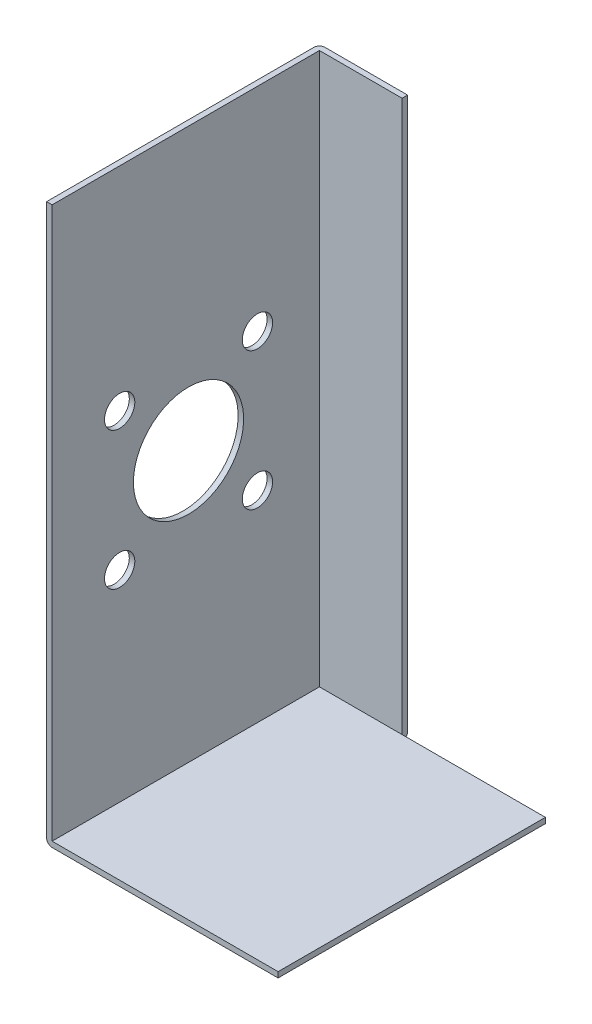
ISO-10303-21;
HEADER;
FILE_DESCRIPTION(('STEP AP214'),'2;1');
FILE_NAME('part.step','',(''),(''),'','','');
FILE_SCHEMA(('AUTOMOTIVE_DESIGN { 1 0 10303 214 1 1 1 1 }'));
ENDSEC;
DATA;
#1=APPLICATION_CONTEXT('core data for automotive mechanical design processes');
#2=APPLICATION_PROTOCOL_DEFINITION('international standard','automotive_design',2000,#1);
#3=PRODUCT_CONTEXT('',#1,'mechanical');
#4=PRODUCT('Part','Part','',(#3));
#5=PRODUCT_RELATED_PRODUCT_CATEGORY('part','',(#4));
#6=PRODUCT_DEFINITION_FORMATION('','',#4);
#7=PRODUCT_DEFINITION_CONTEXT('part definition',#1,'design');
#8=PRODUCT_DEFINITION('design','',#6,#7);
#9=PRODUCT_DEFINITION_SHAPE('','',#8);
#10=(LENGTH_UNIT() NAMED_UNIT(*) SI_UNIT(.MILLI.,.METRE.));
#11=(NAMED_UNIT(*) PLANE_ANGLE_UNIT() SI_UNIT($,.RADIAN.));
#12=(NAMED_UNIT(*) SI_UNIT($,.STERADIAN.) SOLID_ANGLE_UNIT());
#13=UNCERTAINTY_MEASURE_WITH_UNIT(LENGTH_MEASURE(1.E-05),#10,'distance_accuracy_value','');
#14=(GEOMETRIC_REPRESENTATION_CONTEXT(3) GLOBAL_UNCERTAINTY_ASSIGNED_CONTEXT((#13)) GLOBAL_UNIT_ASSIGNED_CONTEXT((#10,
#11,#12)) REPRESENTATION_CONTEXT('',''));
#15=CARTESIAN_POINT('',(0.,0.,0.));
#16=DIRECTION('',(0.,0.,1.));
#17=DIRECTION('',(1.,0.,0.));
#18=AXIS2_PLACEMENT_3D('',#15,#16,#17);
#19=CARTESIAN_POINT('',(2.,0.,0.));
#20=DIRECTION('',(-1.,0.,0.));
#21=DIRECTION('',(0.,0.,1.));
#22=AXIS2_PLACEMENT_3D('',#19,#20,#21);
#23=PLANE('',#22);
#24=CARTESIAN_POINT('',(2.,75.,-74.5));
#25=DIRECTION('',(-1.,0.,0.));
#26=DIRECTION('',(0.,0.,1.));
#27=AXIS2_PLACEMENT_3D('',#24,#25,#26);
#28=CIRCLE('',#27,5.49999999999999);
#29=CARTESIAN_POINT('',(2.,75.,-69.));
#30=VERTEX_POINT('',#29);
#31=EDGE_CURVE('E235',#30,#30,#28,.T.);
#32=ORIENTED_EDGE('',*,*,#31,.T.);
#33=EDGE_LOOP('',(#32));
#34=FACE_BOUND('',#33,.T.);
#35=CARTESIAN_POINT('',(2.,75.,-24.5));
#36=DIRECTION('',(-1.,0.,0.));
#37=DIRECTION('',(0.,0.,1.));
#38=AXIS2_PLACEMENT_3D('',#35,#36,#37);
#39=CIRCLE('',#38,5.5);
#40=CARTESIAN_POINT('',(2.,75.,-19.));
#41=VERTEX_POINT('',#40);
#42=EDGE_CURVE('E361',#41,#41,#39,.T.);
#43=ORIENTED_EDGE('',*,*,#42,.T.);
#44=EDGE_LOOP('',(#43));
#45=FACE_BOUND('',#44,.T.);
#46=CARTESIAN_POINT('',(2.,125.,-74.5));
#47=DIRECTION('',(-1.,0.,0.));
#48=DIRECTION('',(0.,0.,1.));
#49=AXIS2_PLACEMENT_3D('',#46,#47,#48);
#50=CIRCLE('',#49,5.49999999999999);
#51=CARTESIAN_POINT('',(2.,125.,-69.));
#52=VERTEX_POINT('',#51);
#53=EDGE_CURVE('E355',#52,#52,#50,.T.);
#54=ORIENTED_EDGE('',*,*,#53,.T.);
#55=EDGE_LOOP('',(#54));
#56=FACE_BOUND('',#55,.T.);
#57=CARTESIAN_POINT('',(2.,125.,-24.5));
#58=DIRECTION('',(-1.,0.,0.));
#59=DIRECTION('',(0.,0.,1.));
#60=AXIS2_PLACEMENT_3D('',#57,#58,#59);
#61=CIRCLE('',#60,5.5);
#62=CARTESIAN_POINT('',(2.,125.,-19.));
#63=VERTEX_POINT('',#62);
#64=EDGE_CURVE('E352',#63,#63,#61,.T.);
#65=ORIENTED_EDGE('',*,*,#64,.T.);
#66=EDGE_LOOP('',(#65));
#67=FACE_BOUND('',#66,.T.);
#68=CARTESIAN_POINT('',(2.,100.,-49.5));
#69=DIRECTION('',(-1.,0.,0.));
#70=DIRECTION('',(0.,0.,1.));
#71=AXIS2_PLACEMENT_3D('',#68,#69,#70);
#72=CIRCLE('',#71,20.);
#73=CARTESIAN_POINT('',(2.,100.,-29.5));
#74=VERTEX_POINT('',#73);
#75=EDGE_CURVE('E356',#74,#74,#72,.T.);
#76=ORIENTED_EDGE('',*,*,#75,.T.);
#77=EDGE_LOOP('',(#76));
#78=FACE_BOUND('',#77,.T.);
#79=DIRECTION('',(0.,-1.,0.));
#80=VECTOR('',#79,1.);
#81=CARTESIAN_POINT('',(2.,202.,-97.));
#82=LINE('',#81,#80);
#83=CARTESIAN_POINT('',(2.,202.,-97.));
#84=VERTEX_POINT('',#83);
#85=CARTESIAN_POINT('',(2.,2.,-97.));
#86=VERTEX_POINT('',#85);
#87=EDGE_CURVE('E136',#84,#86,#82,.T.);
#88=ORIENTED_EDGE('',*,*,#87,.F.);
#89=DIRECTION('',(0.,0.,1.));
#90=VECTOR('',#89,1.);
#91=CARTESIAN_POINT('',(2.,202.,0.));
#92=LINE('',#91,#90);
#93=CARTESIAN_POINT('',(2.,202.,0.));
#94=VERTEX_POINT('',#93);
#95=EDGE_CURVE('E197',#84,#94,#92,.T.);
#96=ORIENTED_EDGE('',*,*,#95,.T.);
#97=DIRECTION('',(0.,-1.,0.));
#98=VECTOR('',#97,1.);
#99=CARTESIAN_POINT('',(2.,0.,0.));
#100=LINE('',#99,#98);
#101=CARTESIAN_POINT('',(2.,2.,0.));
#102=VERTEX_POINT('',#101);
#103=EDGE_CURVE('E194',#94,#102,#100,.T.);
#104=ORIENTED_EDGE('',*,*,#103,.T.);
#105=DIRECTION('',(0.,0.,1.));
#106=VECTOR('',#105,1.);
#107=CARTESIAN_POINT('',(2.,2.,0.));
#108=LINE('',#107,#106);
#109=EDGE_CURVE('E163',#86,#102,#108,.T.);
#110=ORIENTED_EDGE('',*,*,#109,.F.);
#111=EDGE_LOOP('',(#88,#96,#104,#110));
#112=FACE_BOUND('',#111,.T.);
#113=ADVANCED_FACE('F41',(#34,#45,#56,#67,#78,#112),#23,.F.);
#114=CARTESIAN_POINT('',(84.,2.,-97.));
#115=DIRECTION('',(0.,0.,1.));
#116=DIRECTION('',(1.,0.,0.));
#117=AXIS2_PLACEMENT_3D('',#114,#115,#116);
#118=PLANE('',#117);
#119=DIRECTION('',(0.,-1.,0.));
#120=VECTOR('',#119,1.);
#121=CARTESIAN_POINT('',(32.,202.,-97.));
#122=LINE('',#121,#120);
#123=CARTESIAN_POINT('',(32.,2.,-97.));
#124=VERTEX_POINT('',#123);
#125=CARTESIAN_POINT('',(32.,0.,-97.));
#126=VERTEX_POINT('',#125);
#127=EDGE_CURVE('E151',#124,#126,#122,.T.);
#128=ORIENTED_EDGE('',*,*,#127,.F.);
#129=DIRECTION('',(-1.,0.,0.));
#130=VECTOR('',#129,1.);
#131=CARTESIAN_POINT('',(84.,2.,-97.));
#132=LINE('',#131,#130);
#133=CARTESIAN_POINT('',(84.,2.,-97.));
#134=VERTEX_POINT('',#133);
#135=EDGE_CURVE('E185',#134,#124,#132,.T.);
#136=ORIENTED_EDGE('',*,*,#135,.F.);
#137=DIRECTION('',(0.,1.,0.));
#138=VECTOR('',#137,1.);
#139=CARTESIAN_POINT('',(84.,2.,-97.));
#140=LINE('',#139,#138);
#141=CARTESIAN_POINT('',(84.,0.,-97.));
#142=VERTEX_POINT('',#141);
#143=EDGE_CURVE('E171',#142,#134,#140,.T.);
#144=ORIENTED_EDGE('',*,*,#143,.F.);
#145=DIRECTION('',(-1.,0.,0.));
#146=VECTOR('',#145,1.);
#147=CARTESIAN_POINT('',(84.,0.,-97.));
#148=LINE('',#147,#146);
#149=EDGE_CURVE('E189',#142,#126,#148,.T.);
#150=ORIENTED_EDGE('',*,*,#149,.T.);
#151=EDGE_LOOP('',(#128,#136,#144,#150));
#152=FACE_BOUND('',#151,.T.);
#153=ADVANCED_FACE('F258',(#152),#118,.F.);
#154=CARTESIAN_POINT('',(2.,0.,0.));
#155=DIRECTION('',(0.,0.,-1.));
#156=DIRECTION('',(-1.,0.,0.));
#157=AXIS2_PLACEMENT_3D('',#154,#155,#156);
#158=PLANE('',#157);
#159=DIRECTION('',(0.,-1.,0.));
#160=VECTOR('',#159,1.);
#161=CARTESIAN_POINT('',(0.,0.,0.));
#162=LINE('',#161,#160);
#163=CARTESIAN_POINT('',(0.,202.,0.));
#164=VERTEX_POINT('',#163);
#165=CARTESIAN_POINT('',(0.,2.,0.));
#166=VERTEX_POINT('',#165);
#167=EDGE_CURVE('E193',#164,#166,#162,.T.);
#168=ORIENTED_EDGE('',*,*,#167,.T.);
#169=CARTESIAN_POINT('',(2.,2.,0.));
#170=DIRECTION('',(0.,0.,-1.));
#171=DIRECTION('',(-1.,0.,0.));
#172=AXIS2_PLACEMENT_3D('',#169,#170,#171);
#173=CIRCLE('',#172,2.);
#174=CARTESIAN_POINT('',(2.,0.,0.));
#175=VERTEX_POINT('',#174);
#176=EDGE_CURVE('E51',#166,#175,#173,.F.);
#177=ORIENTED_EDGE('',*,*,#176,.T.);
#178=DIRECTION('',(-1.,0.,0.));
#179=VECTOR('',#178,1.);
#180=CARTESIAN_POINT('',(2.,0.,0.));
#181=LINE('',#180,#179);
#182=CARTESIAN_POINT('',(84.,0.,0.));
#183=VERTEX_POINT('',#182);
#184=EDGE_CURVE('E143',#183,#175,#181,.T.);
#185=ORIENTED_EDGE('',*,*,#184,.F.);
#186=DIRECTION('',(0.,-1.,0.));
#187=VECTOR('',#186,1.);
#188=CARTESIAN_POINT('',(84.,0.,0.));
#189=LINE('',#188,#187);
#190=CARTESIAN_POINT('',(84.,2.,0.));
#191=VERTEX_POINT('',#190);
#192=EDGE_CURVE('E164',#191,#183,#189,.T.);
#193=ORIENTED_EDGE('',*,*,#192,.F.);
#194=DIRECTION('',(-1.,0.,0.));
#195=VECTOR('',#194,1.);
#196=CARTESIAN_POINT('',(84.,2.,0.));
#197=LINE('',#196,#195);
#198=EDGE_CURVE('E177',#191,#102,#197,.T.);
#199=ORIENTED_EDGE('',*,*,#198,.T.);
#200=ORIENTED_EDGE('',*,*,#103,.F.);
#201=DIRECTION('',(-1.,0.,0.));
#202=VECTOR('',#201,1.);
#203=CARTESIAN_POINT('',(2.,202.,0.));
#204=LINE('',#203,#202);
#205=EDGE_CURVE('E144',#94,#164,#204,.T.);
#206=ORIENTED_EDGE('',*,*,#205,.T.);
#207=EDGE_LOOP('',(#168,#177,#185,#193,#199,#200,#206));
#208=FACE_BOUND('',#207,.T.);
#209=ADVANCED_FACE('F270',(#208),#158,.F.);
#210=CARTESIAN_POINT('',(2.,0.,0.));
#211=DIRECTION('',(0.,1.,0.));
#212=DIRECTION('',(0.,0.,1.));
#213=AXIS2_PLACEMENT_3D('',#210,#211,#212);
#214=PLANE('',#213);
#215=DIRECTION('',(0.,0.,-1.));
#216=VECTOR('',#215,1.);
#217=CARTESIAN_POINT('',(2.,0.,-99.));
#218=LINE('',#217,#216);
#219=CARTESIAN_POINT('',(2.,0.,-97.));
#220=VERTEX_POINT('',#219);
#221=EDGE_CURVE('E217',#175,#220,#218,.T.);
#222=ORIENTED_EDGE('',*,*,#221,.T.);
#223=DIRECTION('',(-1.,0.,0.));
#224=VECTOR('',#223,1.);
#225=CARTESIAN_POINT('',(2.,0.,-97.));
#226=LINE('',#225,#224);
#227=EDGE_CURVE('E220',#220,#126,#226,.F.);
#228=ORIENTED_EDGE('',*,*,#227,.T.);
#229=ORIENTED_EDGE('',*,*,#149,.F.);
#230=DIRECTION('',(0.,0.,-1.));
#231=VECTOR('',#230,1.);
#232=CARTESIAN_POINT('',(84.,0.,0.));
#233=LINE('',#232,#231);
#234=EDGE_CURVE('E168',#183,#142,#233,.T.);
#235=ORIENTED_EDGE('',*,*,#234,.F.);
#236=ORIENTED_EDGE('',*,*,#184,.T.);
#237=EDGE_LOOP('',(#222,#228,#229,#235,#236));
#238=FACE_BOUND('',#237,.T.);
#239=ADVANCED_FACE('F251',(#238),#214,.F.);
#240=CARTESIAN_POINT('',(2.,0.,-99.));
#241=DIRECTION('',(0.,0.,1.));
#242=DIRECTION('',(1.,0.,0.));
#243=AXIS2_PLACEMENT_3D('',#240,#241,#242);
#244=PLANE('',#243);
#245=DIRECTION('',(0.,1.,0.));
#246=VECTOR('',#245,1.);
#247=CARTESIAN_POINT('',(32.,202.,-99.));
#248=LINE('',#247,#246);
#249=CARTESIAN_POINT('',(32.,2.,-99.));
#250=VERTEX_POINT('',#249);
#251=CARTESIAN_POINT('',(32.,202.,-99.));
#252=VERTEX_POINT('',#251);
#253=EDGE_CURVE('E122',#250,#252,#248,.T.);
#254=ORIENTED_EDGE('',*,*,#253,.F.);
#255=DIRECTION('',(-1.,0.,0.));
#256=VECTOR('',#255,1.);
#257=CARTESIAN_POINT('',(2.,2.,-99.));
#258=LINE('',#257,#256);
#259=CARTESIAN_POINT('',(2.,2.,-99.));
#260=VERTEX_POINT('',#259);
#261=EDGE_CURVE('E214',#250,#260,#258,.T.);
#262=ORIENTED_EDGE('',*,*,#261,.T.);
#263=DIRECTION('',(0.,1.,0.));
#264=VECTOR('',#263,1.);
#265=CARTESIAN_POINT('',(2.,202.,-99.));
#266=LINE('',#265,#264);
#267=CARTESIAN_POINT('',(2.,202.,-99.));
#268=VERTEX_POINT('',#267);
#269=EDGE_CURVE('E141',#260,#268,#266,.T.);
#270=ORIENTED_EDGE('',*,*,#269,.T.);
#271=DIRECTION('',(-1.,0.,0.));
#272=VECTOR('',#271,1.);
#273=CARTESIAN_POINT('',(2.,202.,-99.));
#274=LINE('',#273,#272);
#275=EDGE_CURVE('E138',#252,#268,#274,.T.);
#276=ORIENTED_EDGE('',*,*,#275,.F.);
#277=EDGE_LOOP('',(#254,#262,#270,#276));
#278=FACE_BOUND('',#277,.T.);
#279=ADVANCED_FACE('F139',(#278),#244,.F.);
#280=CARTESIAN_POINT('',(2.,202.,0.));
#281=DIRECTION('',(0.,-1.,0.));
#282=DIRECTION('',(0.,0.,-1.));
#283=AXIS2_PLACEMENT_3D('',#280,#281,#282);
#284=PLANE('',#283);
#285=ORIENTED_EDGE('',*,*,#275,.T.);
#286=CARTESIAN_POINT('',(2.,202.,-97.));
#287=DIRECTION('',(0.,-1.,0.));
#288=DIRECTION('',(0.,0.,-1.));
#289=AXIS2_PLACEMENT_3D('',#286,#287,#288);
#290=CIRCLE('',#289,2.);
#291=CARTESIAN_POINT('',(0.,202.,-97.));
#292=VERTEX_POINT('',#291);
#293=EDGE_CURVE('E11',#268,#292,#290,.F.);
#294=ORIENTED_EDGE('',*,*,#293,.T.);
#295=DIRECTION('',(0.,0.,1.));
#296=VECTOR('',#295,1.);
#297=CARTESIAN_POINT('',(0.,202.,0.));
#298=LINE('',#297,#296);
#299=EDGE_CURVE('E198',#292,#164,#298,.T.);
#300=ORIENTED_EDGE('',*,*,#299,.T.);
#301=ORIENTED_EDGE('',*,*,#205,.F.);
#302=ORIENTED_EDGE('',*,*,#95,.F.);
#303=DIRECTION('',(-1.,0.,0.));
#304=VECTOR('',#303,1.);
#305=CARTESIAN_POINT('',(32.,202.,-97.));
#306=LINE('',#305,#304);
#307=CARTESIAN_POINT('',(32.,202.,-97.));
#308=VERTEX_POINT('',#307);
#309=EDGE_CURVE('E148',#308,#84,#306,.T.);
#310=ORIENTED_EDGE('',*,*,#309,.F.);
#311=DIRECTION('',(0.,0.,1.));
#312=VECTOR('',#311,1.);
#313=CARTESIAN_POINT('',(32.,202.,-99.));
#314=LINE('',#313,#312);
#315=EDGE_CURVE('E128',#252,#308,#314,.T.);
#316=ORIENTED_EDGE('',*,*,#315,.F.);
#317=EDGE_LOOP('',(#285,#294,#300,#301,#302,#310,#316));
#318=FACE_BOUND('',#317,.T.);
#319=ADVANCED_FACE('F146',(#318),#284,.F.);
#320=CARTESIAN_POINT('',(0.,0.,0.));
#321=DIRECTION('',(-1.,0.,0.));
#322=DIRECTION('',(0.,0.,1.));
#323=AXIS2_PLACEMENT_3D('',#320,#321,#322);
#324=PLANE('',#323);
#325=CARTESIAN_POINT('',(0.,75.,-74.5));
#326=DIRECTION('',(-1.,0.,0.));
#327=DIRECTION('',(0.,0.,1.));
#328=AXIS2_PLACEMENT_3D('',#325,#326,#327);
#329=CIRCLE('',#328,5.49999999999999);
#330=CARTESIAN_POINT('',(0.,75.,-69.));
#331=VERTEX_POINT('',#330);
#332=EDGE_CURVE('E384',#331,#331,#329,.T.);
#333=ORIENTED_EDGE('',*,*,#332,.F.);
#334=EDGE_LOOP('',(#333));
#335=FACE_BOUND('',#334,.T.);
#336=CARTESIAN_POINT('',(0.,75.,-24.5));
#337=DIRECTION('',(-1.,0.,0.));
#338=DIRECTION('',(0.,0.,-1.));
#339=AXIS2_PLACEMENT_3D('',#336,#337,#338);
#340=CIRCLE('',#339,5.5);
#341=CARTESIAN_POINT('',(0.,75.,-30.));
#342=VERTEX_POINT('',#341);
#343=EDGE_CURVE('E388',#342,#342,#340,.T.);
#344=ORIENTED_EDGE('',*,*,#343,.F.);
#345=EDGE_LOOP('',(#344));
#346=FACE_BOUND('',#345,.T.);
#347=CARTESIAN_POINT('',(0.,125.,-74.5));
#348=DIRECTION('',(-1.,0.,0.));
#349=DIRECTION('',(0.,0.,-1.));
#350=AXIS2_PLACEMENT_3D('',#347,#348,#349);
#351=CIRCLE('',#350,5.49999999999999);
#352=CARTESIAN_POINT('',(0.,125.,-80.));
#353=VERTEX_POINT('',#352);
#354=EDGE_CURVE('E392',#353,#353,#351,.T.);
#355=ORIENTED_EDGE('',*,*,#354,.F.);
#356=EDGE_LOOP('',(#355));
#357=FACE_BOUND('',#356,.T.);
#358=CARTESIAN_POINT('',(0.,125.,-24.5));
#359=DIRECTION('',(-1.,0.,0.));
#360=DIRECTION('',(0.,0.,1.));
#361=AXIS2_PLACEMENT_3D('',#358,#359,#360);
#362=CIRCLE('',#361,5.5);
#363=CARTESIAN_POINT('',(0.,125.,-19.));
#364=VERTEX_POINT('',#363);
#365=EDGE_CURVE('E349',#364,#364,#362,.T.);
#366=ORIENTED_EDGE('',*,*,#365,.F.);
#367=EDGE_LOOP('',(#366));
#368=FACE_BOUND('',#367,.T.);
#369=CARTESIAN_POINT('',(0.,100.,-49.5));
#370=DIRECTION('',(-1.,0.,0.));
#371=DIRECTION('',(0.,0.,1.));
#372=AXIS2_PLACEMENT_3D('',#369,#370,#371);
#373=CIRCLE('',#372,20.);
#374=CARTESIAN_POINT('',(0.,100.,-29.5));
#375=VERTEX_POINT('',#374);
#376=EDGE_CURVE('E364',#375,#375,#373,.T.);
#377=ORIENTED_EDGE('',*,*,#376,.F.);
#378=EDGE_LOOP('',(#377));
#379=FACE_BOUND('',#378,.T.);
#380=DIRECTION('',(0.,1.,0.));
#381=VECTOR('',#380,1.);
#382=CARTESIAN_POINT('',(0.,0.,-97.));
#383=LINE('',#382,#381);
#384=CARTESIAN_POINT('',(0.,2.,-97.));
#385=VERTEX_POINT('',#384);
#386=EDGE_CURVE('E59',#292,#385,#383,.F.);
#387=ORIENTED_EDGE('',*,*,#386,.T.);
#388=DIRECTION('',(0.,0.,-1.));
#389=VECTOR('',#388,1.);
#390=CARTESIAN_POINT('',(0.,2.,0.));
#391=LINE('',#390,#389);
#392=EDGE_CURVE('E227',#385,#166,#391,.F.);
#393=ORIENTED_EDGE('',*,*,#392,.T.);
#394=ORIENTED_EDGE('',*,*,#167,.F.);
#395=ORIENTED_EDGE('',*,*,#299,.F.);
#396=EDGE_LOOP('',(#387,#393,#394,#395));
#397=FACE_BOUND('',#396,.T.);
#398=ADVANCED_FACE('F269',(#335,#346,#357,#368,#379,#397),#324,.T.);
#399=CARTESIAN_POINT('',(84.,2.,0.));
#400=DIRECTION('',(0.,-1.,0.));
#401=DIRECTION('',(0.,0.,-1.));
#402=AXIS2_PLACEMENT_3D('',#399,#400,#401);
#403=PLANE('',#402);
#404=ORIENTED_EDGE('',*,*,#109,.T.);
#405=ORIENTED_EDGE('',*,*,#198,.F.);
#406=DIRECTION('',(0.,0.,1.));
#407=VECTOR('',#406,1.);
#408=CARTESIAN_POINT('',(84.,2.,0.));
#409=LINE('',#408,#407);
#410=EDGE_CURVE('E174',#134,#191,#409,.T.);
#411=ORIENTED_EDGE('',*,*,#410,.F.);
#412=ORIENTED_EDGE('',*,*,#135,.T.);
#413=EDGE_CURVE('E184',#124,#86,#132,.T.);
#414=ORIENTED_EDGE('',*,*,#413,.T.);
#415=EDGE_LOOP('',(#404,#405,#411,#412,#414));
#416=FACE_BOUND('',#415,.T.);
#417=ADVANCED_FACE('F280',(#416),#403,.F.);
#418=CARTESIAN_POINT('',(84.,0.,0.));
#419=DIRECTION('',(-1.,0.,0.));
#420=DIRECTION('',(0.,0.,1.));
#421=AXIS2_PLACEMENT_3D('',#418,#419,#420);
#422=PLANE('',#421);
#423=ORIENTED_EDGE('',*,*,#192,.T.);
#424=ORIENTED_EDGE('',*,*,#234,.T.);
#425=ORIENTED_EDGE('',*,*,#143,.T.);
#426=ORIENTED_EDGE('',*,*,#410,.T.);
#427=EDGE_LOOP('',(#423,#424,#425,#426));
#428=FACE_BOUND('',#427,.T.);
#429=ADVANCED_FACE('F261',(#428),#422,.F.);
#430=CARTESIAN_POINT('',(32.,202.,-97.));
#431=DIRECTION('',(0.,0.,-1.));
#432=DIRECTION('',(0.,1.,0.));
#433=AXIS2_PLACEMENT_3D('',#430,#431,#432);
#434=PLANE('',#433);
#435=ORIENTED_EDGE('',*,*,#87,.T.);
#436=ORIENTED_EDGE('',*,*,#413,.F.);
#437=EDGE_CURVE('E154',#308,#124,#122,.T.);
#438=ORIENTED_EDGE('',*,*,#437,.F.);
#439=ORIENTED_EDGE('',*,*,#309,.T.);
#440=EDGE_LOOP('',(#435,#436,#438,#439));
#441=FACE_BOUND('',#440,.T.);
#442=ADVANCED_FACE('F278',(#441),#434,.F.);
#443=CARTESIAN_POINT('',(32.,0.,0.));
#444=DIRECTION('',(-1.,0.,0.));
#445=DIRECTION('',(0.,0.,1.));
#446=AXIS2_PLACEMENT_3D('',#443,#444,#445);
#447=PLANE('',#446);
#448=ORIENTED_EDGE('',*,*,#127,.T.);
#449=CARTESIAN_POINT('',(32.,2.,-97.));
#450=DIRECTION('',(-1.,0.,0.));
#451=DIRECTION('',(0.,0.,1.));
#452=AXIS2_PLACEMENT_3D('',#449,#450,#451);
#453=CIRCLE('',#452,2.);
#454=EDGE_CURVE('E131',#126,#250,#453,.F.);
#455=ORIENTED_EDGE('',*,*,#454,.T.);
#456=ORIENTED_EDGE('',*,*,#253,.T.);
#457=ORIENTED_EDGE('',*,*,#315,.T.);
#458=ORIENTED_EDGE('',*,*,#437,.T.);
#459=EDGE_LOOP('',(#448,#455,#456,#457,#458));
#460=FACE_BOUND('',#459,.T.);
#461=ADVANCED_FACE('F125',(#460),#447,.F.);
#462=CARTESIAN_POINT('',(2.,0.,-97.));
#463=DIRECTION('',(0.,-1.,0.));
#464=DIRECTION('',(0.,0.,-1.));
#465=AXIS2_PLACEMENT_3D('',#462,#463,#464);
#466=CYLINDRICAL_SURFACE('',#465,2.);
#467=ORIENTED_EDGE('',*,*,#293,.F.);
#468=ORIENTED_EDGE('',*,*,#269,.F.);
#469=CARTESIAN_POINT('',(2.,2.,-97.));
#470=DIRECTION('',(0.,-1.,0.));
#471=DIRECTION('',(0.,0.,-1.));
#472=AXIS2_PLACEMENT_3D('',#469,#470,#471);
#473=CIRCLE('',#472,2.);
#474=EDGE_CURVE('E45',#385,#260,#473,.T.);
#475=ORIENTED_EDGE('',*,*,#474,.F.);
#476=ORIENTED_EDGE('',*,*,#386,.F.);
#477=EDGE_LOOP('',(#467,#468,#475,#476));
#478=FACE_BOUND('',#477,.T.);
#479=ADVANCED_FACE('F43',(#478),#466,.T.);
#480=CARTESIAN_POINT('',(2.,2.,0.));
#481=DIRECTION('',(0.,0.,1.));
#482=DIRECTION('',(1.,0.,0.));
#483=AXIS2_PLACEMENT_3D('',#480,#481,#482);
#484=CYLINDRICAL_SURFACE('',#483,2.);
#485=ORIENTED_EDGE('',*,*,#176,.F.);
#486=ORIENTED_EDGE('',*,*,#392,.F.);
#487=CARTESIAN_POINT('',(2.,2.,-97.));
#488=DIRECTION('',(0.,0.,-1.));
#489=DIRECTION('',(-1.,0.,0.));
#490=AXIS2_PLACEMENT_3D('',#487,#488,#489);
#491=CIRCLE('',#490,2.);
#492=EDGE_CURVE('E234',#220,#385,#491,.T.);
#493=ORIENTED_EDGE('',*,*,#492,.F.);
#494=ORIENTED_EDGE('',*,*,#221,.F.);
#495=EDGE_LOOP('',(#485,#486,#493,#494));
#496=FACE_BOUND('',#495,.T.);
#497=ADVANCED_FACE('F267',(#496),#484,.T.);
#498=CARTESIAN_POINT('',(2.,2.,-97.));
#499=DIRECTION('',(-1.,0.,0.));
#500=DIRECTION('',(0.,0.,1.));
#501=AXIS2_PLACEMENT_3D('',#498,#499,#500);
#502=SPHERICAL_SURFACE('',#501,2.);
#503=ORIENTED_EDGE('',*,*,#492,.T.);
#504=ORIENTED_EDGE('',*,*,#474,.T.);
#505=CARTESIAN_POINT('',(2.,2.,-97.));
#506=DIRECTION('',(-1.,0.,0.));
#507=DIRECTION('',(0.,0.,1.));
#508=AXIS2_PLACEMENT_3D('',#505,#506,#507);
#509=CIRCLE('',#508,2.);
#510=EDGE_CURVE('E232',#220,#260,#509,.F.);
#511=ORIENTED_EDGE('',*,*,#510,.F.);
#512=EDGE_LOOP('',(#503,#504,#511));
#513=FACE_BOUND('',#512,.T.);
#514=ADVANCED_FACE('F244',(#513),#502,.T.);
#515=CARTESIAN_POINT('',(2.,2.,-97.));
#516=DIRECTION('',(-1.,0.,0.));
#517=DIRECTION('',(0.,0.,1.));
#518=AXIS2_PLACEMENT_3D('',#515,#516,#517);
#519=CYLINDRICAL_SURFACE('',#518,2.);
#520=ORIENTED_EDGE('',*,*,#454,.F.);
#521=ORIENTED_EDGE('',*,*,#227,.F.);
#522=ORIENTED_EDGE('',*,*,#510,.T.);
#523=ORIENTED_EDGE('',*,*,#261,.F.);
#524=EDGE_LOOP('',(#520,#521,#522,#523));
#525=FACE_BOUND('',#524,.T.);
#526=ADVANCED_FACE('F247',(#525),#519,.T.);
#527=CARTESIAN_POINT('',(41.,100.,-49.5));
#528=DIRECTION('',(-1.,0.,0.));
#529=DIRECTION('',(0.,0.,1.));
#530=AXIS2_PLACEMENT_3D('',#527,#528,#529);
#531=CYLINDRICAL_SURFACE('',#530,20.);
#532=ORIENTED_EDGE('',*,*,#376,.T.);
#533=EDGE_LOOP('',(#532));
#534=FACE_BOUND('',#533,.T.);
#535=ORIENTED_EDGE('',*,*,#75,.F.);
#536=EDGE_LOOP('',(#535));
#537=FACE_BOUND('',#536,.T.);
#538=ADVANCED_FACE('F311',(#534,#537),#531,.F.);
#539=CARTESIAN_POINT('',(41.,125.,-24.5));
#540=DIRECTION('',(-1.,0.,0.));
#541=DIRECTION('',(0.,0.,1.));
#542=AXIS2_PLACEMENT_3D('',#539,#540,#541);
#543=CYLINDRICAL_SURFACE('',#542,5.5);
#544=ORIENTED_EDGE('',*,*,#365,.T.);
#545=EDGE_LOOP('',(#544));
#546=FACE_BOUND('',#545,.T.);
#547=ORIENTED_EDGE('',*,*,#64,.F.);
#548=EDGE_LOOP('',(#547));
#549=FACE_BOUND('',#548,.T.);
#550=ADVANCED_FACE('F328',(#546,#549),#543,.F.);
#551=CARTESIAN_POINT('',(41.,125.,-74.5));
#552=DIRECTION('',(-1.,0.,0.));
#553=DIRECTION('',(0.,0.,1.));
#554=AXIS2_PLACEMENT_3D('',#551,#552,#553);
#555=CYLINDRICAL_SURFACE('',#554,5.49999999999999);
#556=ORIENTED_EDGE('',*,*,#354,.T.);
#557=EDGE_LOOP('',(#556));
#558=FACE_BOUND('',#557,.T.);
#559=ORIENTED_EDGE('',*,*,#53,.F.);
#560=EDGE_LOOP('',(#559));
#561=FACE_BOUND('',#560,.T.);
#562=ADVANCED_FACE('F337',(#558,#561),#555,.F.);
#563=CARTESIAN_POINT('',(41.,75.,-24.5));
#564=DIRECTION('',(-1.,0.,0.));
#565=DIRECTION('',(0.,0.,1.));
#566=AXIS2_PLACEMENT_3D('',#563,#564,#565);
#567=CYLINDRICAL_SURFACE('',#566,5.5);
#568=ORIENTED_EDGE('',*,*,#343,.T.);
#569=EDGE_LOOP('',(#568));
#570=FACE_BOUND('',#569,.T.);
#571=ORIENTED_EDGE('',*,*,#42,.F.);
#572=EDGE_LOOP('',(#571));
#573=FACE_BOUND('',#572,.T.);
#574=ADVANCED_FACE('F333',(#570,#573),#567,.F.);
#575=CARTESIAN_POINT('',(41.,75.,-74.5));
#576=DIRECTION('',(-1.,0.,0.));
#577=DIRECTION('',(0.,0.,1.));
#578=AXIS2_PLACEMENT_3D('',#575,#576,#577);
#579=CYLINDRICAL_SURFACE('',#578,5.49999999999999);
#580=ORIENTED_EDGE('',*,*,#332,.T.);
#581=EDGE_LOOP('',(#580));
#582=FACE_BOUND('',#581,.T.);
#583=ORIENTED_EDGE('',*,*,#31,.F.);
#584=EDGE_LOOP('',(#583));
#585=FACE_BOUND('',#584,.T.);
#586=ADVANCED_FACE('F330',(#582,#585),#579,.F.);
#587=CLOSED_SHELL('',(#113,#153,#209,#239,#279,#319,#398,#417,#429,#442,#461,#479,#497,#514,
#526,#538,#550,#562,#574,#586));
#588=MANIFOLD_SOLID_BREP('B2',#587);
#589=ADVANCED_BREP_SHAPE_REPRESENTATION('',(#18,#588),#14);
#590=SHAPE_DEFINITION_REPRESENTATION(#9,#589);
ENDSEC;
END-ISO-10303-21;
